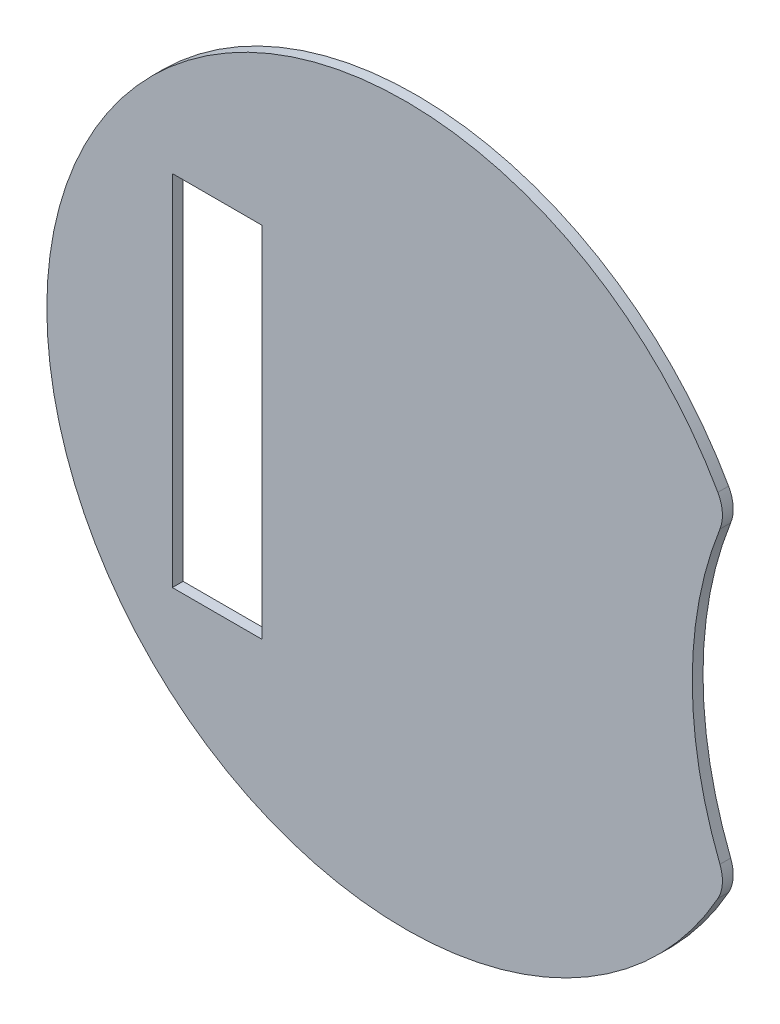
ISO-10303-21;
HEADER;
FILE_DESCRIPTION(('STEP AP214'),'2;1');
FILE_NAME('part.step','',(''),(''),'','','');
FILE_SCHEMA(('AUTOMOTIVE_DESIGN { 1 0 10303 214 1 1 1 1 }'));
ENDSEC;
DATA;
#1=APPLICATION_CONTEXT('core data for automotive mechanical design processes');
#2=APPLICATION_PROTOCOL_DEFINITION('international standard','automotive_design',2000,#1);
#3=PRODUCT_CONTEXT('',#1,'mechanical');
#4=PRODUCT('Part','Part','',(#3));
#5=PRODUCT_RELATED_PRODUCT_CATEGORY('part','',(#4));
#6=PRODUCT_DEFINITION_FORMATION('','',#4);
#7=PRODUCT_DEFINITION_CONTEXT('part definition',#1,'design');
#8=PRODUCT_DEFINITION('design','',#6,#7);
#9=PRODUCT_DEFINITION_SHAPE('','',#8);
#10=(LENGTH_UNIT() NAMED_UNIT(*) SI_UNIT(.MILLI.,.METRE.));
#11=(NAMED_UNIT(*) PLANE_ANGLE_UNIT() SI_UNIT($,.RADIAN.));
#12=(NAMED_UNIT(*) SI_UNIT($,.STERADIAN.) SOLID_ANGLE_UNIT());
#13=UNCERTAINTY_MEASURE_WITH_UNIT(LENGTH_MEASURE(1.E-05),#10,'distance_accuracy_value','');
#14=(GEOMETRIC_REPRESENTATION_CONTEXT(3) GLOBAL_UNCERTAINTY_ASSIGNED_CONTEXT((#13)) GLOBAL_UNIT_ASSIGNED_CONTEXT((#10,
#11,#12)) REPRESENTATION_CONTEXT('',''));
#15=CARTESIAN_POINT('',(0.,0.,0.));
#16=DIRECTION('',(0.,0.,1.));
#17=DIRECTION('',(1.,0.,0.));
#18=AXIS2_PLACEMENT_3D('',#15,#16,#17);
#19=CARTESIAN_POINT('',(0.,0.,3.));
#20=DIRECTION('',(0.,0.,-1.));
#21=DIRECTION('',(-1.,0.,0.));
#22=AXIS2_PLACEMENT_3D('',#19,#20,#21);
#23=CYLINDRICAL_SURFACE('',#22,100.);
#24=CARTESIAN_POINT('',(0.,0.,0.));
#25=DIRECTION('',(0.,0.,1.));
#26=DIRECTION('',(1.,0.,0.));
#27=AXIS2_PLACEMENT_3D('',#24,#25,#26);
#28=CIRCLE('',#27,100.);
#29=CARTESIAN_POINT('',(87.1345029239766,49.0670806161475,0.));
#30=VERTEX_POINT('',#29);
#31=CARTESIAN_POINT('',(87.1345029239766,-49.0670806161475,0.));
#32=VERTEX_POINT('',#31);
#33=EDGE_CURVE('E137',#30,#32,#28,.T.);
#34=ORIENTED_EDGE('',*,*,#33,.T.);
#35=DIRECTION('',(0.,0.,-1.));
#36=VECTOR('',#35,1.);
#37=CARTESIAN_POINT('',(87.1345029239766,-49.0670806161475,3.));
#38=LINE('',#37,#36);
#39=CARTESIAN_POINT('',(87.1345029239766,-49.0670806161475,3.));
#40=VERTEX_POINT('',#39);
#41=EDGE_CURVE('E148',#32,#40,#38,.F.);
#42=ORIENTED_EDGE('',*,*,#41,.T.);
#43=CARTESIAN_POINT('',(0.,0.,3.));
#44=DIRECTION('',(0.,0.,1.));
#45=DIRECTION('',(1.,0.,0.));
#46=AXIS2_PLACEMENT_3D('',#43,#44,#45);
#47=CIRCLE('',#46,100.);
#48=CARTESIAN_POINT('',(87.1345029239766,49.0670806161475,3.));
#49=VERTEX_POINT('',#48);
#50=EDGE_CURVE('E140',#49,#40,#47,.T.);
#51=ORIENTED_EDGE('',*,*,#50,.F.);
#52=DIRECTION('',(0.,0.,-1.));
#53=VECTOR('',#52,1.);
#54=CARTESIAN_POINT('',(87.1345029239766,49.0670806161475,3.));
#55=LINE('',#54,#53);
#56=EDGE_CURVE('E143',#49,#30,#55,.T.);
#57=ORIENTED_EDGE('',*,*,#56,.T.);
#58=EDGE_LOOP('',(#34,#42,#51,#57));
#59=FACE_BOUND('',#58,.T.);
#60=ADVANCED_FACE('F33',(#59),#23,.T.);
#61=CARTESIAN_POINT('',(0.,0.,3.));
#62=DIRECTION('',(0.,0.,1.));
#63=DIRECTION('',(1.,0.,0.));
#64=AXIS2_PLACEMENT_3D('',#61,#62,#63);
#65=PLANE('',#64);
#66=DIRECTION('',(0.,-1.,0.));
#67=VECTOR('',#66,1.);
#68=CARTESIAN_POINT('',(-40.,50.,3.));
#69=LINE('',#68,#67);
#70=CARTESIAN_POINT('',(-40.,50.,3.));
#71=VERTEX_POINT('',#70);
#72=CARTESIAN_POINT('',(-40.,-50.,3.));
#73=VERTEX_POINT('',#72);
#74=EDGE_CURVE('E99',#71,#73,#69,.T.);
#75=ORIENTED_EDGE('',*,*,#74,.T.);
#76=DIRECTION('',(-1.,0.,0.));
#77=VECTOR('',#76,1.);
#78=CARTESIAN_POINT('',(-40.,-50.,3.));
#79=LINE('',#78,#77);
#80=CARTESIAN_POINT('',(-65.,-50.,3.));
#81=VERTEX_POINT('',#80);
#82=EDGE_CURVE('E108',#73,#81,#79,.T.);
#83=ORIENTED_EDGE('',*,*,#82,.T.);
#84=DIRECTION('',(0.,1.,0.));
#85=VECTOR('',#84,1.);
#86=CARTESIAN_POINT('',(-65.,50.,3.));
#87=LINE('',#86,#85);
#88=CARTESIAN_POINT('',(-65.,50.,3.));
#89=VERTEX_POINT('',#88);
#90=EDGE_CURVE('E48',#81,#89,#87,.T.);
#91=ORIENTED_EDGE('',*,*,#90,.T.);
#92=DIRECTION('',(1.,0.,0.));
#93=VECTOR('',#92,1.);
#94=CARTESIAN_POINT('',(-40.,50.,3.));
#95=LINE('',#94,#93);
#96=EDGE_CURVE('E105',#89,#71,#95,.T.);
#97=ORIENTED_EDGE('',*,*,#96,.T.);
#98=EDGE_LOOP('',(#75,#83,#91,#97));
#99=FACE_BOUND('',#98,.T.);
#100=ORIENTED_EDGE('',*,*,#50,.T.);
#101=CARTESIAN_POINT('',(78.4210526315789,-44.1603725545327,3.));
#102=DIRECTION('',(0.,0.,1.));
#103=DIRECTION('',(1.,0.,0.));
#104=AXIS2_PLACEMENT_3D('',#101,#102,#103);
#105=CIRCLE('',#104,10.);
#106=CARTESIAN_POINT('',(87.719298245614,-40.4803415083217,3.));
#107=VERTEX_POINT('',#106);
#108=EDGE_CURVE('E153',#40,#107,#105,.T.);
#109=ORIENTED_EDGE('',*,*,#108,.T.);
#110=CARTESIAN_POINT('',(190.,0.,3.));
#111=DIRECTION('',(0.,0.,1.));
#112=DIRECTION('',(1.,0.,0.));
#113=AXIS2_PLACEMENT_3D('',#110,#111,#112);
#114=CIRCLE('',#113,110.);
#115=CARTESIAN_POINT('',(87.719298245614,40.4803415083217,3.));
#116=VERTEX_POINT('',#115);
#117=EDGE_CURVE('E130',#116,#107,#114,.T.);
#118=ORIENTED_EDGE('',*,*,#117,.F.);
#119=CARTESIAN_POINT('',(78.4210526315789,44.1603725545327,3.));
#120=DIRECTION('',(0.,0.,1.));
#121=DIRECTION('',(1.,0.,0.));
#122=AXIS2_PLACEMENT_3D('',#119,#120,#121);
#123=CIRCLE('',#122,10.);
#124=EDGE_CURVE('E151',#116,#49,#123,.T.);
#125=ORIENTED_EDGE('',*,*,#124,.T.);
#126=EDGE_LOOP('',(#100,#109,#118,#125));
#127=FACE_BOUND('',#126,.T.);
#128=ADVANCED_FACE('F112',(#99,#127),#65,.T.);
#129=CARTESIAN_POINT('',(0.,0.,0.));
#130=DIRECTION('',(0.,0.,1.));
#131=DIRECTION('',(1.,0.,0.));
#132=AXIS2_PLACEMENT_3D('',#129,#130,#131);
#133=PLANE('',#132);
#134=DIRECTION('',(-1.,0.,0.));
#135=VECTOR('',#134,1.);
#136=CARTESIAN_POINT('',(-40.,-50.,0.));
#137=LINE('',#136,#135);
#138=CARTESIAN_POINT('',(-40.,-50.,0.));
#139=VERTEX_POINT('',#138);
#140=CARTESIAN_POINT('',(-65.,-50.,0.));
#141=VERTEX_POINT('',#140);
#142=EDGE_CURVE('E124',#139,#141,#137,.T.);
#143=ORIENTED_EDGE('',*,*,#142,.F.);
#144=DIRECTION('',(0.,-1.,0.));
#145=VECTOR('',#144,1.);
#146=CARTESIAN_POINT('',(-40.,50.,0.));
#147=LINE('',#146,#145);
#148=CARTESIAN_POINT('',(-40.,50.,0.));
#149=VERTEX_POINT('',#148);
#150=EDGE_CURVE('E56',#149,#139,#147,.T.);
#151=ORIENTED_EDGE('',*,*,#150,.F.);
#152=DIRECTION('',(1.,0.,0.));
#153=VECTOR('',#152,1.);
#154=CARTESIAN_POINT('',(-40.,50.,0.));
#155=LINE('',#154,#153);
#156=CARTESIAN_POINT('',(-65.,50.,0.));
#157=VERTEX_POINT('',#156);
#158=EDGE_CURVE('E115',#157,#149,#155,.T.);
#159=ORIENTED_EDGE('',*,*,#158,.F.);
#160=DIRECTION('',(0.,1.,0.));
#161=VECTOR('',#160,1.);
#162=CARTESIAN_POINT('',(-65.,50.,0.));
#163=LINE('',#162,#161);
#164=EDGE_CURVE('E118',#141,#157,#163,.T.);
#165=ORIENTED_EDGE('',*,*,#164,.F.);
#166=EDGE_LOOP('',(#143,#151,#159,#165));
#167=FACE_BOUND('',#166,.T.);
#168=CARTESIAN_POINT('',(190.,0.,0.));
#169=DIRECTION('',(0.,0.,1.));
#170=DIRECTION('',(1.,0.,0.));
#171=AXIS2_PLACEMENT_3D('',#168,#169,#170);
#172=CIRCLE('',#171,110.);
#173=CARTESIAN_POINT('',(87.719298245614,40.4803415083217,0.));
#174=VERTEX_POINT('',#173);
#175=CARTESIAN_POINT('',(87.719298245614,-40.4803415083217,0.));
#176=VERTEX_POINT('',#175);
#177=EDGE_CURVE('E134',#174,#176,#172,.T.);
#178=ORIENTED_EDGE('',*,*,#177,.T.);
#179=CARTESIAN_POINT('',(78.4210526315789,-44.1603725545327,0.));
#180=DIRECTION('',(0.,0.,1.));
#181=DIRECTION('',(1.,0.,0.));
#182=AXIS2_PLACEMENT_3D('',#179,#180,#181);
#183=CIRCLE('',#182,10.);
#184=EDGE_CURVE('E11',#176,#32,#183,.F.);
#185=ORIENTED_EDGE('',*,*,#184,.T.);
#186=ORIENTED_EDGE('',*,*,#33,.F.);
#187=CARTESIAN_POINT('',(78.4210526315789,44.1603725545327,0.));
#188=DIRECTION('',(0.,0.,1.));
#189=DIRECTION('',(1.,0.,0.));
#190=AXIS2_PLACEMENT_3D('',#187,#188,#189);
#191=CIRCLE('',#190,10.);
#192=EDGE_CURVE('E41',#30,#174,#191,.F.);
#193=ORIENTED_EDGE('',*,*,#192,.T.);
#194=EDGE_LOOP('',(#178,#185,#186,#193));
#195=FACE_BOUND('',#194,.T.);
#196=ADVANCED_FACE('F161',(#167,#195),#133,.F.);
#197=CARTESIAN_POINT('',(190.,0.,0.));
#198=DIRECTION('',(0.,0.,1.));
#199=DIRECTION('',(1.,0.,0.));
#200=AXIS2_PLACEMENT_3D('',#197,#198,#199);
#201=CYLINDRICAL_SURFACE('',#200,110.);
#202=ORIENTED_EDGE('',*,*,#117,.T.);
#203=DIRECTION('',(0.,0.,1.));
#204=VECTOR('',#203,1.);
#205=CARTESIAN_POINT('',(87.719298245614,-40.4803415083217,0.));
#206=LINE('',#205,#204);
#207=EDGE_CURVE('E157',#107,#176,#206,.F.);
#208=ORIENTED_EDGE('',*,*,#207,.T.);
#209=ORIENTED_EDGE('',*,*,#177,.F.);
#210=DIRECTION('',(0.,0.,1.));
#211=VECTOR('',#210,1.);
#212=CARTESIAN_POINT('',(87.719298245614,40.4803415083217,0.));
#213=LINE('',#212,#211);
#214=EDGE_CURVE('E155',#174,#116,#213,.T.);
#215=ORIENTED_EDGE('',*,*,#214,.T.);
#216=EDGE_LOOP('',(#202,#208,#209,#215));
#217=FACE_BOUND('',#216,.T.);
#218=ADVANCED_FACE('F167',(#217),#201,.F.);
#219=CARTESIAN_POINT('',(78.4210526315789,-44.1603725545327,0.));
#220=DIRECTION('',(0.,0.,-1.));
#221=DIRECTION('',(-1.,0.,0.));
#222=AXIS2_PLACEMENT_3D('',#219,#220,#221);
#223=CYLINDRICAL_SURFACE('',#222,10.);
#224=ORIENTED_EDGE('',*,*,#184,.F.);
#225=ORIENTED_EDGE('',*,*,#207,.F.);
#226=ORIENTED_EDGE('',*,*,#108,.F.);
#227=ORIENTED_EDGE('',*,*,#41,.F.);
#228=EDGE_LOOP('',(#224,#225,#226,#227));
#229=FACE_BOUND('',#228,.T.);
#230=ADVANCED_FACE('F175',(#229),#223,.T.);
#231=CARTESIAN_POINT('',(78.4210526315789,44.1603725545327,0.));
#232=DIRECTION('',(0.,0.,1.));
#233=DIRECTION('',(1.,0.,0.));
#234=AXIS2_PLACEMENT_3D('',#231,#232,#233);
#235=CYLINDRICAL_SURFACE('',#234,10.);
#236=ORIENTED_EDGE('',*,*,#124,.F.);
#237=ORIENTED_EDGE('',*,*,#214,.F.);
#238=ORIENTED_EDGE('',*,*,#192,.F.);
#239=ORIENTED_EDGE('',*,*,#56,.F.);
#240=EDGE_LOOP('',(#236,#237,#238,#239));
#241=FACE_BOUND('',#240,.T.);
#242=ADVANCED_FACE('F35',(#241),#235,.T.);
#243=CARTESIAN_POINT('',(-40.,50.,3.));
#244=DIRECTION('',(1.,0.,0.));
#245=DIRECTION('',(0.,1.,0.));
#246=AXIS2_PLACEMENT_3D('',#243,#244,#245);
#247=PLANE('',#246);
#248=ORIENTED_EDGE('',*,*,#150,.T.);
#249=DIRECTION('',(0.,0.,-1.));
#250=VECTOR('',#249,1.);
#251=CARTESIAN_POINT('',(-40.,-50.,3.));
#252=LINE('',#251,#250);
#253=EDGE_CURVE('E95',#73,#139,#252,.T.);
#254=ORIENTED_EDGE('',*,*,#253,.F.);
#255=ORIENTED_EDGE('',*,*,#74,.F.);
#256=DIRECTION('',(0.,0.,-1.));
#257=VECTOR('',#256,1.);
#258=CARTESIAN_POINT('',(-40.,50.,3.));
#259=LINE('',#258,#257);
#260=EDGE_CURVE('E128',#71,#149,#259,.T.);
#261=ORIENTED_EDGE('',*,*,#260,.T.);
#262=EDGE_LOOP('',(#248,#254,#255,#261));
#263=FACE_BOUND('',#262,.T.);
#264=ADVANCED_FACE('F97',(#263),#247,.F.);
#265=CARTESIAN_POINT('',(-40.,50.,3.));
#266=DIRECTION('',(0.,1.,0.));
#267=DIRECTION('',(0.,0.,1.));
#268=AXIS2_PLACEMENT_3D('',#265,#266,#267);
#269=PLANE('',#268);
#270=ORIENTED_EDGE('',*,*,#158,.T.);
#271=ORIENTED_EDGE('',*,*,#260,.F.);
#272=ORIENTED_EDGE('',*,*,#96,.F.);
#273=DIRECTION('',(0.,0.,-1.));
#274=VECTOR('',#273,1.);
#275=CARTESIAN_POINT('',(-65.,50.,3.));
#276=LINE('',#275,#274);
#277=EDGE_CURVE('E131',#89,#157,#276,.T.);
#278=ORIENTED_EDGE('',*,*,#277,.T.);
#279=EDGE_LOOP('',(#270,#271,#272,#278));
#280=FACE_BOUND('',#279,.T.);
#281=ADVANCED_FACE('F195',(#280),#269,.F.);
#282=CARTESIAN_POINT('',(-65.,50.,3.));
#283=DIRECTION('',(-1.,0.,0.));
#284=DIRECTION('',(0.,-1.,0.));
#285=AXIS2_PLACEMENT_3D('',#282,#283,#284);
#286=PLANE('',#285);
#287=ORIENTED_EDGE('',*,*,#164,.T.);
#288=ORIENTED_EDGE('',*,*,#277,.F.);
#289=ORIENTED_EDGE('',*,*,#90,.F.);
#290=DIRECTION('',(0.,0.,-1.));
#291=VECTOR('',#290,1.);
#292=CARTESIAN_POINT('',(-65.,-50.,3.));
#293=LINE('',#292,#291);
#294=EDGE_CURVE('E104',#81,#141,#293,.T.);
#295=ORIENTED_EDGE('',*,*,#294,.T.);
#296=EDGE_LOOP('',(#287,#288,#289,#295));
#297=FACE_BOUND('',#296,.T.);
#298=ADVANCED_FACE('F198',(#297),#286,.F.);
#299=CARTESIAN_POINT('',(-40.,-50.,3.));
#300=DIRECTION('',(0.,-1.,0.));
#301=DIRECTION('',(0.,0.,-1.));
#302=AXIS2_PLACEMENT_3D('',#299,#300,#301);
#303=PLANE('',#302);
#304=ORIENTED_EDGE('',*,*,#142,.T.);
#305=ORIENTED_EDGE('',*,*,#294,.F.);
#306=ORIENTED_EDGE('',*,*,#82,.F.);
#307=ORIENTED_EDGE('',*,*,#253,.T.);
#308=EDGE_LOOP('',(#304,#305,#306,#307));
#309=FACE_BOUND('',#308,.T.);
#310=ADVANCED_FACE('F109',(#309),#303,.F.);
#311=CLOSED_SHELL('',(#60,#128,#196,#218,#230,#242,#264,#281,#298,#310));
#312=MANIFOLD_SOLID_BREP('B2',#311);
#313=ADVANCED_BREP_SHAPE_REPRESENTATION('',(#18,#312),#14);
#314=SHAPE_DEFINITION_REPRESENTATION(#9,#313);
ENDSEC;
END-ISO-10303-21;
